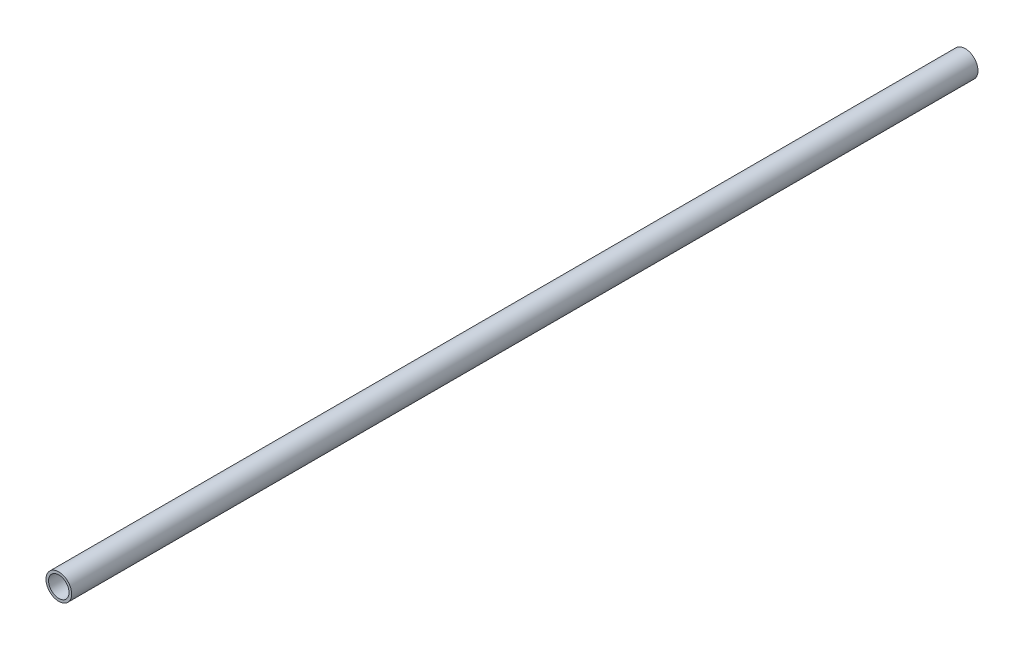
ISO-10303-21;
HEADER;
FILE_DESCRIPTION(('STEP AP214'),'2;1');
FILE_NAME('part.step','',(''),(''),'','','');
FILE_SCHEMA(('AUTOMOTIVE_DESIGN { 1 0 10303 214 1 1 1 1 }'));
ENDSEC;
DATA;
#1=APPLICATION_CONTEXT('core data for automotive mechanical design processes');
#2=APPLICATION_PROTOCOL_DEFINITION('international standard','automotive_design',2000,#1);
#3=PRODUCT_CONTEXT('',#1,'mechanical');
#4=PRODUCT('Part','Part','',(#3));
#5=PRODUCT_RELATED_PRODUCT_CATEGORY('part','',(#4));
#6=PRODUCT_DEFINITION_FORMATION('','',#4);
#7=PRODUCT_DEFINITION_CONTEXT('part definition',#1,'design');
#8=PRODUCT_DEFINITION('design','',#6,#7);
#9=PRODUCT_DEFINITION_SHAPE('','',#8);
#10=(LENGTH_UNIT() NAMED_UNIT(*) SI_UNIT(.MILLI.,.METRE.));
#11=(NAMED_UNIT(*) PLANE_ANGLE_UNIT() SI_UNIT($,.RADIAN.));
#12=(NAMED_UNIT(*) SI_UNIT($,.STERADIAN.) SOLID_ANGLE_UNIT());
#13=UNCERTAINTY_MEASURE_WITH_UNIT(LENGTH_MEASURE(1.E-05),#10,'distance_accuracy_value','');
#14=(GEOMETRIC_REPRESENTATION_CONTEXT(3) GLOBAL_UNCERTAINTY_ASSIGNED_CONTEXT((#13)) GLOBAL_UNIT_ASSIGNED_CONTEXT((#10,
#11,#12)) REPRESENTATION_CONTEXT('',''));
#15=CARTESIAN_POINT('',(0.,0.,0.));
#16=DIRECTION('',(0.,0.,1.));
#17=DIRECTION('',(1.,0.,0.));
#18=AXIS2_PLACEMENT_3D('',#15,#16,#17);
#19=CARTESIAN_POINT('',(0.,0.,1181.1));
#20=DIRECTION('',(0.,0.,1.));
#21=DIRECTION('',(1.,0.,0.));
#22=AXIS2_PLACEMENT_3D('',#19,#20,#21);
#23=PLANE('',#22);
#24=CARTESIAN_POINT('',(0.,0.,1181.1));
#25=DIRECTION('',(0.,0.,1.));
#26=DIRECTION('',(1.,0.,0.));
#27=AXIS2_PLACEMENT_3D('',#24,#25,#26);
#28=CIRCLE('',#27,16.7005);
#29=CARTESIAN_POINT('',(16.7005,0.,1181.1));
#30=VERTEX_POINT('',#29);
#31=EDGE_CURVE('E10',#30,#30,#28,.T.);
#32=ORIENTED_EDGE('',*,*,#31,.T.);
#33=EDGE_LOOP('',(#32));
#34=FACE_BOUND('',#33,.T.);
#35=CARTESIAN_POINT('',(0.,0.,1181.1));
#36=DIRECTION('',(0.,0.,1.));
#37=DIRECTION('',(1.,0.,0.));
#38=AXIS2_PLACEMENT_3D('',#35,#36,#37);
#39=CIRCLE('',#38,13.3223);
#40=CARTESIAN_POINT('',(13.3223,0.,1181.1));
#41=VERTEX_POINT('',#40);
#42=EDGE_CURVE('E41',#41,#41,#39,.T.);
#43=ORIENTED_EDGE('',*,*,#42,.F.);
#44=EDGE_LOOP('',(#43));
#45=FACE_BOUND('',#44,.T.);
#46=ADVANCED_FACE('F30',(#34,#45),#23,.T.);
#47=CARTESIAN_POINT('',(0.,0.,0.));
#48=DIRECTION('',(0.,0.,1.));
#49=DIRECTION('',(1.,0.,0.));
#50=AXIS2_PLACEMENT_3D('',#47,#48,#49);
#51=PLANE('',#50);
#52=CARTESIAN_POINT('',(0.,0.,0.));
#53=DIRECTION('',(0.,0.,1.));
#54=DIRECTION('',(1.,0.,0.));
#55=AXIS2_PLACEMENT_3D('',#52,#53,#54);
#56=CIRCLE('',#55,16.7005);
#57=CARTESIAN_POINT('',(16.7005,0.,0.));
#58=VERTEX_POINT('',#57);
#59=EDGE_CURVE('E34',#58,#58,#56,.T.);
#60=ORIENTED_EDGE('',*,*,#59,.F.);
#61=EDGE_LOOP('',(#60));
#62=FACE_BOUND('',#61,.T.);
#63=CARTESIAN_POINT('',(0.,0.,0.));
#64=DIRECTION('',(0.,0.,1.));
#65=DIRECTION('',(1.,0.,0.));
#66=AXIS2_PLACEMENT_3D('',#63,#64,#65);
#67=CIRCLE('',#66,13.3223);
#68=CARTESIAN_POINT('',(13.3223,0.,0.));
#69=VERTEX_POINT('',#68);
#70=EDGE_CURVE('E43',#69,#69,#67,.T.);
#71=ORIENTED_EDGE('',*,*,#70,.T.);
#72=EDGE_LOOP('',(#71));
#73=FACE_BOUND('',#72,.T.);
#74=ADVANCED_FACE('F53',(#62,#73),#51,.F.);
#75=CARTESIAN_POINT('',(0.,0.,1181.1));
#76=DIRECTION('',(0.,0.,-1.));
#77=DIRECTION('',(-1.,0.,0.));
#78=AXIS2_PLACEMENT_3D('',#75,#76,#77);
#79=CYLINDRICAL_SURFACE('',#78,16.7005);
#80=ORIENTED_EDGE('',*,*,#31,.F.);
#81=EDGE_LOOP('',(#80));
#82=FACE_BOUND('',#81,.T.);
#83=ORIENTED_EDGE('',*,*,#59,.T.);
#84=EDGE_LOOP('',(#83));
#85=FACE_BOUND('',#84,.T.);
#86=ADVANCED_FACE('F32',(#82,#85),#79,.T.);
#87=CARTESIAN_POINT('',(0.,0.,1181.1));
#88=DIRECTION('',(0.,0.,-1.));
#89=DIRECTION('',(-1.,0.,0.));
#90=AXIS2_PLACEMENT_3D('',#87,#88,#89);
#91=CYLINDRICAL_SURFACE('',#90,13.3223);
#92=ORIENTED_EDGE('',*,*,#42,.T.);
#93=EDGE_LOOP('',(#92));
#94=FACE_BOUND('',#93,.T.);
#95=ORIENTED_EDGE('',*,*,#70,.F.);
#96=EDGE_LOOP('',(#95));
#97=FACE_BOUND('',#96,.T.);
#98=ADVANCED_FACE('F49',(#94,#97),#91,.F.);
#99=CLOSED_SHELL('',(#46,#74,#86,#98));
#100=MANIFOLD_SOLID_BREP('B2',#99);
#101=ADVANCED_BREP_SHAPE_REPRESENTATION('',(#18,#100),#14);
#102=SHAPE_DEFINITION_REPRESENTATION(#9,#101);
ENDSEC;
END-ISO-10303-21;
